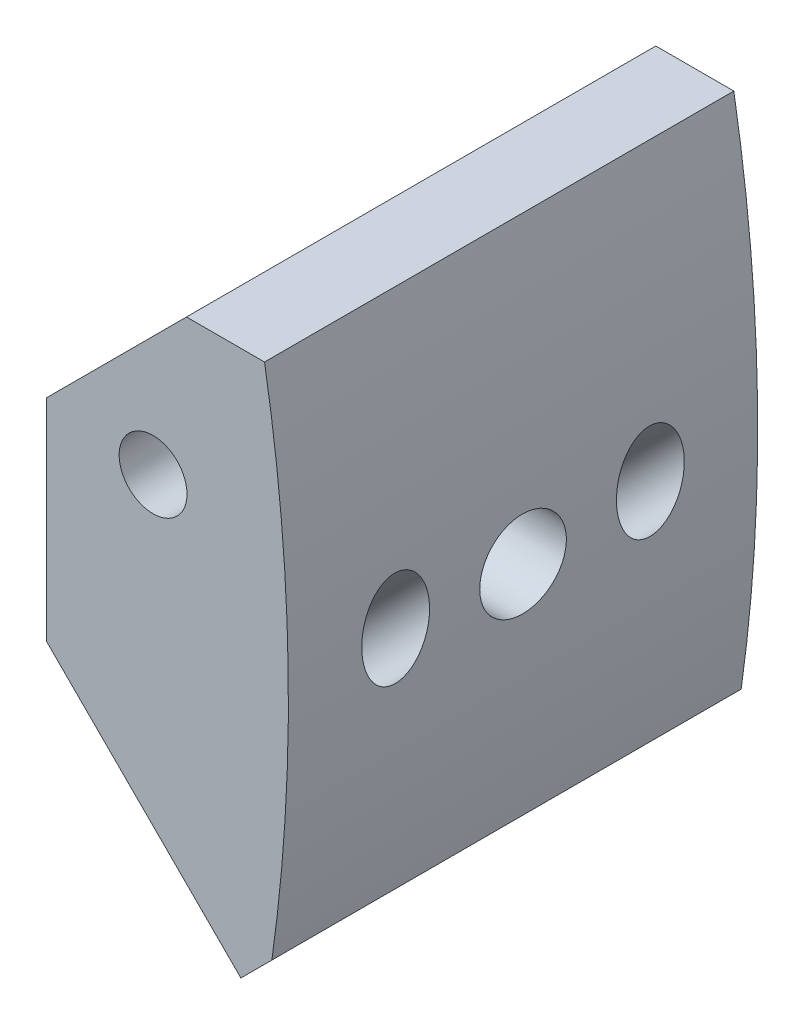
ISO-10303-21;
HEADER;
FILE_DESCRIPTION(('STEP AP214'),'2;1');
FILE_NAME('part.step','',(''),(''),'','','');
FILE_SCHEMA(('AUTOMOTIVE_DESIGN { 1 0 10303 214 1 1 1 1 }'));
ENDSEC;
DATA;
#1=APPLICATION_CONTEXT('core data for automotive mechanical design processes');
#2=APPLICATION_PROTOCOL_DEFINITION('international standard','automotive_design',2000,#1);
#3=PRODUCT_CONTEXT('',#1,'mechanical');
#4=PRODUCT('Part','Part','',(#3));
#5=PRODUCT_RELATED_PRODUCT_CATEGORY('part','',(#4));
#6=PRODUCT_DEFINITION_FORMATION('','',#4);
#7=PRODUCT_DEFINITION_CONTEXT('part definition',#1,'design');
#8=PRODUCT_DEFINITION('design','',#6,#7);
#9=PRODUCT_DEFINITION_SHAPE('','',#8);
#10=(LENGTH_UNIT() NAMED_UNIT(*) SI_UNIT(.MILLI.,.METRE.));
#11=(NAMED_UNIT(*) PLANE_ANGLE_UNIT() SI_UNIT($,.RADIAN.));
#12=(NAMED_UNIT(*) SI_UNIT($,.STERADIAN.) SOLID_ANGLE_UNIT());
#13=UNCERTAINTY_MEASURE_WITH_UNIT(LENGTH_MEASURE(1.E-05),#10,'distance_accuracy_value','');
#14=(GEOMETRIC_REPRESENTATION_CONTEXT(3) GLOBAL_UNCERTAINTY_ASSIGNED_CONTEXT((#13)) GLOBAL_UNIT_ASSIGNED_CONTEXT((#10,
#11,#12)) REPRESENTATION_CONTEXT('',''));
#15=CARTESIAN_POINT('',(0.,0.,0.));
#16=DIRECTION('',(0.,0.,1.));
#17=DIRECTION('',(1.,0.,0.));
#18=AXIS2_PLACEMENT_3D('',#15,#16,#17);
#19=CARTESIAN_POINT('',(-47.244,-6.58729003997056,18.7198));
#20=DIRECTION('',(0.,0.,-1.));
#21=DIRECTION('',(-1.,0.,0.));
#22=AXIS2_PLACEMENT_3D('',#19,#20,#21);
#23=CYLINDRICAL_SURFACE('',#22,66.294);
#24=CARTESIAN_POINT('',(19.05,-6.58729003997057,11.0871));
#25=CARTESIAN_POINT('',(19.0499996965808,-6.49029011763072,11.0870957038607));
#26=CARTESIAN_POINT('',(19.0497848234207,-6.3932202802505,11.0789012698086));
#27=CARTESIAN_POINT('',(19.0489483082885,-6.20175517058592,11.0463264377884));
#28=CARTESIAN_POINT('',(19.0483261795265,-6.10736324023725,11.0219266691839));
#29=CARTESIAN_POINT('',(19.0467456131249,-5.9240554226076,10.9576373316004));
#30=CARTESIAN_POINT('',(19.0457873390727,-5.83513689635548,10.9177552961659));
#31=CARTESIAN_POINT('',(19.0436425963866,-5.66528198959924,10.8236442233512));
#32=CARTESIAN_POINT('',(19.0424561837321,-5.58434365830945,10.7694187042804));
#33=CARTESIAN_POINT('',(19.0399882662549,-5.43269097827881,10.648135365401));
#34=CARTESIAN_POINT('',(19.0387067314511,-5.36197987388215,10.5810734891702));
#35=CARTESIAN_POINT('',(19.0361932730682,-5.2328160281673,10.4360277439134));
#36=CARTESIAN_POINT('',(19.0349613514597,-5.17436377337172,10.3580434416087));
#37=CARTESIAN_POINT('',(19.032685916437,-5.07137329412594,10.193356396944));
#38=CARTESIAN_POINT('',(19.0316424263435,-5.02683679141392,10.1066525775073));
#39=CARTESIAN_POINT('',(19.0298617644816,-4.95295334594229,9.92699542845012));
#40=CARTESIAN_POINT('',(19.0291245916354,-4.92360634973139,9.8340421208227));
#41=CARTESIAN_POINT('',(19.0280398829489,-4.8809413263353,9.64454701808837));
#42=CARTESIAN_POINT('',(19.0276922582412,-4.86761964325202,9.54800604662771));
#43=CARTESIAN_POINT('',(19.0274255738305,-4.85737214696877,9.35405747529695));
#44=CARTESIAN_POINT('',(19.0275065126475,-4.86044627714623,9.25664987842089));
#45=CARTESIAN_POINT('',(19.0280877451644,-4.88290002733904,9.06375790994818));
#46=CARTESIAN_POINT('',(19.0285879370586,-4.9022756889159,8.96827307721711));
#47=CARTESIAN_POINT('',(19.0299511275993,-4.95677637963944,8.78191186219641));
#48=CARTESIAN_POINT('',(19.0308141269425,-4.99190143902833,8.69103548875638));
#49=CARTESIAN_POINT('',(19.0328057619046,-5.07690839178007,8.51645815347474));
#50=CARTESIAN_POINT('',(19.0339344301956,-5.12679210035419,8.43275807590188));
#51=CARTESIAN_POINT('',(19.036330130382,-5.23989896873011,8.27491899974449));
#52=CARTESIAN_POINT('',(19.0375971625022,-5.30312215019547,8.20078001668767));
#53=CARTESIAN_POINT('',(19.0401272077553,-5.44113569133263,8.06414459374687));
#54=CARTESIAN_POINT('',(19.0413902195809,-5.51592948571427,8.00165162313855));
#55=CARTESIAN_POINT('',(19.0437694771187,-5.67494899416805,7.89010889306282));
#56=CARTESIAN_POINT('',(19.0448857228083,-5.75917470968648,7.84105913565682));
#57=CARTESIAN_POINT('',(19.0468456242787,-5.93466908917434,7.75779558672417));
#58=CARTESIAN_POINT('',(19.0476892780887,-6.02593780405674,7.7235819024575));
#59=CARTESIAN_POINT('',(19.0490088586277,-6.21292650873927,7.67096391731566));
#60=CARTESIAN_POINT('',(19.0494847861157,-6.30864648935182,7.65255958381096));
#61=CARTESIAN_POINT('',(19.0500151667441,-6.50179041461503,7.6320869831968));
#62=CARTESIAN_POINT('',(19.050069743725,-6.59921385015981,7.63001391611013));
#63=CARTESIAN_POINT('',(19.0497515988955,-6.79302563666371,7.64225018957412));
#64=CARTESIAN_POINT('',(19.0493788774536,-6.88941398851568,7.65655951599222));
#65=CARTESIAN_POINT('',(19.0482482255402,-7.07840609586226,7.701150411519));
#66=CARTESIAN_POINT('',(19.0474903475853,-7.17101036546318,7.73142980310495));
#67=CARTESIAN_POINT('',(19.0456747947692,-7.34982136180033,7.8070990889758));
#68=CARTESIAN_POINT('',(19.0446171194631,-7.43602807904024,7.85248900568973));
#69=CARTESIAN_POINT('',(19.0423208355982,-7.59961895748349,7.95710324508831));
#70=CARTESIAN_POINT('',(19.0410821847991,-7.67700105145836,8.0163307994683));
#71=CARTESIAN_POINT('',(19.0385636995081,-7.82072532163809,8.14693430724377));
#72=CARTESIAN_POINT('',(19.0372838649327,-7.88706747548156,8.21831028524527));
#73=CARTESIAN_POINT('',(19.0348269424432,-8.00684464408938,8.37120508147937));
#74=CARTESIAN_POINT('',(19.0336498792266,-8.06027656174518,8.45272632642443));
#75=CARTESIAN_POINT('',(19.0315315961777,-8.15269532300266,8.623585127682));
#76=CARTESIAN_POINT('',(19.0305903758834,-8.19168219490804,8.71292266867879));
#77=CARTESIAN_POINT('',(19.0290500742096,-8.25409875185362,8.89686640836887));
#78=CARTESIAN_POINT('',(19.0284509486511,-8.27753044579814,8.99147192500783));
#79=CARTESIAN_POINT('',(19.0276622613252,-8.30817809781455,9.18327581664484));
#80=CARTESIAN_POINT('',(19.0274726994678,-8.31539405945109,9.2804741910729));
#81=CARTESIAN_POINT('',(19.0275245282422,-8.31340516458679,9.47467358644387));
#82=CARTESIAN_POINT('',(19.0277657905008,-8.30420519955953,9.57167465755556));
#83=CARTESIAN_POINT('',(19.0286517995259,-8.26965564739085,9.76275500902498));
#84=CARTESIAN_POINT('',(19.0292965470955,-8.24430602810661,9.85683428356705));
#85=CARTESIAN_POINT('',(19.0309168270153,-8.17817727251902,10.0394027224271));
#86=CARTESIAN_POINT('',(19.0318923651202,-8.13739786778749,10.1278917894623));
#87=CARTESIAN_POINT('',(19.0340642058242,-8.0415692386408,10.2967653761377));
#88=CARTESIAN_POINT('',(19.0352605002712,-7.98652054112911,10.3771501948806));
#89=CARTESIAN_POINT('',(19.0377393259736,-7.86370321135577,10.5275549056016));
#90=CARTESIAN_POINT('',(19.0390218737009,-7.79593214503367,10.5975728095751));
#91=CARTESIAN_POINT('',(19.0415287850443,-7.64957731166828,10.7252560272962));
#92=CARTESIAN_POINT('',(19.0427531341612,-7.57099086895314,10.7829182752599));
#93=CARTESIAN_POINT('',(19.0450059931981,-7.4052095376815,10.8842608260837));
#94=CARTESIAN_POINT('',(19.046034383979,-7.31800946079425,10.9279326339297));
#95=CARTESIAN_POINT('',(19.0477771868896,-7.13757985767573,10.9999656701603));
#96=CARTESIAN_POINT('',(19.0484919737294,-7.04435768066933,11.0283451798781));
#97=CARTESIAN_POINT('',(19.0493357183067,-6.89000278840161,11.0614566402422));
#98=CARTESIAN_POINT('',(19.0495837449924,-6.82987223063493,11.0710608245613));
#99=CARTESIAN_POINT('',(19.0499159809689,-6.70893362867922,11.0838838509421));
#100=CARTESIAN_POINT('',(19.0500001902958,-6.64812558463983,11.0871026944142));
#101=CARTESIAN_POINT('',(19.05,-6.58729003997057,11.0871));
#102=B_SPLINE_CURVE_WITH_KNOTS('',3,(#24,#25,#26,#27,#28,#29,#30,#31,#32,#33,#34,#35,#36,#37,
#38,#39,#40,#41,#42,#43,#44,#45,#46,#47,#48,#49,#50,#51,#52,#53,#54,#55,#56,#57,#58,#59,#60,#61,
#62,#63,#64,#65,#66,#67,#68,#69,#70,#71,#72,#73,#74,#75,#76,#77,#78,#79,#80,#81,#82,#83,#84,#85,
#86,#87,#88,#89,#90,#91,#92,#93,#94,#95,#96,#97,#98,#99,#100,#101),.UNSPECIFIED.,.T.,.F.,(4,2,2,
2,2,2,2,2,2,2,2,2,2,2,2,2,2,2,2,2,2,2,2,2,2,2,2,2,2,2,2,2,2,2,2,2,2,2,4),(0.,0.290777711365592,
0.581903623562939,0.872888053476482,1.16380117397663,1.4548063782738,1.74582312964384,
2.03687587306248,2.3279275922707,2.61891290046217,2.90989720374316,3.20081086880587,
3.49172509248768,3.78267511148184,4.07362560298806,4.36466262879617,4.65569969923233,
4.94673887373656,5.23777744755217,5.52873047805297,5.81968325755811,6.11059637582465,
6.40150992590461,6.69249148509315,6.98347363365747,7.27452551839871,7.56557683284851,
7.85659055158264,8.14760420634426,8.43853116189429,8.72945869648085,9.02039129249465,
9.31131314715163,9.60229071819405,9.89334040552073,10.1845664851068,10.4754436387533,
10.6578110461634,10.84017841329),.UNSPECIFIED.);
#103=CARTESIAN_POINT('',(19.05,-6.58729003997057,11.0871));
#104=VERTEX_POINT('',#103);
#105=EDGE_CURVE('E169',#104,#104,#102,.T.);
#106=ORIENTED_EDGE('',*,*,#105,.T.);
#107=EDGE_LOOP('',(#106));
#108=FACE_BOUND('',#107,.T.);
#109=CARTESIAN_POINT('',(19.03093950099,-8.17689066280571,14.4399));
#110=CARTESIAN_POINT('',(19.0309397504888,-8.17688373606508,14.4994299092389));
#111=CARTESIAN_POINT('',(19.0310783077648,-8.17113538618392,14.5590630278307));
#112=CARTESIAN_POINT('',(19.0316118028481,-8.14864667310725,14.6762839148779));
#113=CARTESIAN_POINT('',(19.0320074198384,-8.13187718939261,14.7338658374767));
#114=CARTESIAN_POINT('',(19.0329949072261,-8.08890022916926,14.8448157281223));
#115=CARTESIAN_POINT('',(19.0335852014114,-8.06276841304478,14.8982134109924));
#116=CARTESIAN_POINT('',(19.0348944566818,-8.0027362014352,15.0003633799949));
#117=CARTESIAN_POINT('',(19.0356134275248,-7.96883521673711,15.0491153133967));
#118=CARTESIAN_POINT('',(19.0374439992075,-7.87857983434721,15.1619693773191));
#119=CARTESIAN_POINT('',(19.0385893749711,-7.8189027046317,15.2234114026122));
#120=CARTESIAN_POINT('',(19.0408509914559,-7.69052187414516,15.3360267127651));
#121=CARTESIAN_POINT('',(19.041967154257,-7.62179650096414,15.387174572624));
#122=CARTESIAN_POINT('',(19.0444749663972,-7.44905546769553,15.4983692864074));
#123=CARTESIAN_POINT('',(19.0457959560247,-7.34199252826299,15.5536745420608));
#124=CARTESIAN_POINT('',(19.0479480347883,-7.12057220248545,15.646582539313));
#125=CARTESIAN_POINT('',(19.0487787239021,-7.00620894407258,15.6841708211072));
#126=CARTESIAN_POINT('',(19.0498564383536,-6.76997817793614,15.7436243327146));
#127=CARTESIAN_POINT('',(19.0500858867901,-6.64798929327223,15.7650033410691));
#128=CARTESIAN_POINT('',(19.0498557455246,-6.40218118767083,15.7907531443561));
#129=CARTESIAN_POINT('',(19.049395635741,-6.27836065501827,15.7951110926511));
#130=CARTESIAN_POINT('',(19.047618940738,-6.00612452257654,15.7858256043066));
#131=CARTESIAN_POINT('',(19.0461473478288,-5.85782262926841,15.7683452337203));
#132=CARTESIAN_POINT('',(19.0423022857426,-5.56668691032533,15.7071205546782));
#133=CARTESIAN_POINT('',(19.0399301478624,-5.42384535400005,15.6634149604779));
#134=CARTESIAN_POINT('',(19.0355406405651,-5.19998639905921,15.5683606782304));
#135=CARTESIAN_POINT('',(19.0337064139218,-5.11532901326914,15.5255267391557));
#136=CARTESIAN_POINT('',(19.0299155060611,-4.95356747771057,15.4273827974884));
#137=CARTESIAN_POINT('',(19.027959034268,-4.87645096090689,15.3720937306922));
#138=CARTESIAN_POINT('',(19.024542635703,-4.74941051854124,15.2623773367114));
#139=CARTESIAN_POINT('',(19.0230696560592,-4.69726495319207,15.2105314965473));
#140=CARTESIAN_POINT('',(19.0202826253287,-4.60195624247808,15.0991094905497));
#141=CARTESIAN_POINT('',(19.0189683855247,-4.55878238621959,15.039542682043));
#142=CARTESIAN_POINT('',(19.0168442878389,-4.49064821714003,14.9246017053715));
#143=CARTESIAN_POINT('',(19.0159863530743,-4.46381854329087,14.8703411050301));
#144=CARTESIAN_POINT('',(19.0145527172215,-4.41954414804442,14.758094370884));
#145=CARTESIAN_POINT('',(19.013976842422,-4.40209364968191,14.7001105550368));
#146=CARTESIAN_POINT('',(19.0131684031765,-4.37771401365817,14.5816521154748));
#147=CARTESIAN_POINT('',(19.0129374776605,-4.37083509949825,14.5211669953215));
#148=CARTESIAN_POINT('',(19.0128527528125,-4.36830329984476,14.3999620861377));
#149=CARTESIAN_POINT('',(19.0129988993884,-4.37264880418048,14.3392423320138));
#150=CARTESIAN_POINT('',(19.0136241974261,-4.39144250263048,14.2242810975946));
#151=CARTESIAN_POINT('',(19.014076552431,-4.40507828136987,14.1699031685768));
#152=CARTESIAN_POINT('',(19.015241347591,-4.44073747283191,14.0639978827775));
#153=CARTESIAN_POINT('',(19.0159538266458,-4.46276214007438,14.0124709536704));
#154=CARTESIAN_POINT('',(19.0176312994868,-4.51572192999796,13.9099739407884));
#155=CARTESIAN_POINT('',(19.0186096764612,-4.54714242000995,13.8592568449645));
#156=CARTESIAN_POINT('',(19.0207157564483,-4.61673228492073,13.7627203721038));
#157=CARTESIAN_POINT('',(19.0218435475059,-4.65490564355157,13.7169039118506));
#158=CARTESIAN_POINT('',(19.0247893239268,-4.75812271316617,13.6077150544386));
#159=CARTESIAN_POINT('',(19.0266591863696,-4.82676178455779,13.5477309020521));
#160=CARTESIAN_POINT('',(19.0303784714529,-4.97280178226283,13.4395477614496));
#161=CARTESIAN_POINT('',(19.0322278326506,-5.05022380333932,13.3913780646114));
#162=CARTESIAN_POINT('',(19.0363846714238,-5.23939545277268,13.2912285417164));
#163=CARTESIAN_POINT('',(19.0386232667553,-5.35361163971813,13.2439114715794));
#164=CARTESIAN_POINT('',(19.0425725957761,-5.58802140924562,13.1682090928461));
#165=CARTESIAN_POINT('',(19.0442830280784,-5.70821835939102,13.1398345827938));
#166=CARTESIAN_POINT('',(19.0470935469368,-5.95419167506841,13.1002904478532));
#167=CARTESIAN_POINT('',(19.0481788191046,-6.08003276940403,13.089528095931));
#168=CARTESIAN_POINT('',(19.04962884144,-6.33208350038816,13.0857656228831));
#169=CARTESIAN_POINT('',(19.0499928008706,-6.45829338976348,13.0927849757213));
#170=CARTESIAN_POINT('',(19.0500082655554,-6.73136712643059,13.1274798056241));
#171=CARTESIAN_POINT('',(19.0495176363884,-6.87779706126136,13.1586910103579));
#172=CARTESIAN_POINT('',(19.0476554871312,-7.16258461609256,13.2472024912822));
#173=CARTESIAN_POINT('',(19.0462858506555,-7.30095880872602,13.3044469049614));
#174=CARTESIAN_POINT('',(19.0436559695904,-7.50760963247391,13.4177007951448));
#175=CARTESIAN_POINT('',(19.0425877251546,-7.58107921862573,13.4642957488383));
#176=CARTESIAN_POINT('',(19.0403536495612,-7.72029355684978,13.5678924769256));
#177=CARTESIAN_POINT('',(19.0391879872331,-7.78605121734095,13.6248764412789));
#178=CARTESIAN_POINT('',(19.0371545918018,-7.89312224415153,13.7357716497249));
#179=CARTESIAN_POINT('',(19.0362781184018,-7.93662249090891,13.7875615527944));
#180=CARTESIAN_POINT('',(19.0346408386178,-8.01478112524079,13.8975035982089));
#181=CARTESIAN_POINT('',(19.0338799314092,-8.04944723818555,13.9556501177115));
#182=CARTESIAN_POINT('',(19.0326901777474,-8.10233142246484,14.0665400018734));
#183=CARTESIAN_POINT('',(19.0322263601696,-8.1223770676385,14.1184095431279));
#184=CARTESIAN_POINT('',(19.031497923776,-8.15351458340183,14.2247124202177));
#185=CARTESIAN_POINT('',(19.0312327782093,-8.16463013657257,14.2791385669838));
#186=CARTESIAN_POINT('',(19.0310355972113,-8.17287968059016,14.3516161549604));
#187=CARTESIAN_POINT('',(19.0309996503764,-8.17438129465964,14.3692355013328));
#188=CARTESIAN_POINT('',(19.0309515629479,-8.17638790908686,14.4045335208673));
#189=CARTESIAN_POINT('',(19.0309394268578,-8.17689272091015,14.4222122046192));
#190=CARTESIAN_POINT('',(19.03093950099,-8.17689066280571,14.4399));
#191=B_SPLINE_CURVE_WITH_KNOTS('',3,(#109,#110,#111,#112,#113,#114,#115,#116,#117,#118,#119,
#120,#121,#122,#123,#124,#125,#126,#127,#128,#129,#130,#131,#132,#133,#134,#135,#136,#137,#138,
#139,#140,#141,#142,#143,#144,#145,#146,#147,#148,#149,#150,#151,#152,#153,#154,#155,#156,#157,
#158,#159,#160,#161,#162,#163,#164,#165,#166,#167,#168,#169,#170,#171,#172,#173,#174,#175,#176,
#177,#178,#179,#180,#181,#182,#183,#184,#185,#186,#187,#188,#189,#190),.UNSPECIFIED.,.T.,.F.,(4,
2,2,2,2,2,2,2,2,2,2,2,2,2,2,2,2,2,2,2,2,2,2,2,2,2,2,2,2,2,2,2,2,2,2,2,2,2,2,2,4),(0.,
0.178506171985479,0.357485907280734,0.535050712911975,0.712628989500063,0.968185601983157,
1.22436585657518,1.58395316400954,1.94383344457157,2.31412293514639,2.68469184760296,
3.13054371649606,3.5757390226817,3.85954039913289,4.14286824760459,4.36272671799192,
4.58232118248879,4.7631842541117,4.94393579775003,5.12554343021684,5.30712501206479,
5.47457746690626,5.64205497333309,5.82039753309282,5.99884565580937,6.27084425573026,
6.54351055082744,6.91247637575028,7.28165235701928,7.65925056727915,8.03726248996457,
8.48425685284617,8.93029654053938,9.19057455638824,9.45041049905095,9.65262032290747,
9.8546527045458,10.020812348109,10.1865298684965,10.2395583993646,10.2925969590509),.UNSPECIFIED.);
#192=CARTESIAN_POINT('',(19.03093950099,-8.17689066280571,14.4399));
#193=VERTEX_POINT('',#192);
#194=EDGE_CURVE('E130',#193,#193,#191,.T.);
#195=ORIENTED_EDGE('',*,*,#194,.T.);
#196=EDGE_LOOP('',(#195));
#197=FACE_BOUND('',#196,.T.);
#198=CARTESIAN_POINT('',(19.03093950099,-8.17689066280571,4.2799));
#199=CARTESIAN_POINT('',(19.0309397504888,-8.17688373606507,4.33942990923894));
#200=CARTESIAN_POINT('',(19.0310783077648,-8.17113538618392,4.39906302783068));
#201=CARTESIAN_POINT('',(19.0316118028481,-8.14864667310726,4.5162839148779));
#202=CARTESIAN_POINT('',(19.0320074198384,-8.13187718939262,4.57386583747667));
#203=CARTESIAN_POINT('',(19.0329949072261,-8.08890022916927,4.68481572812225));
#204=CARTESIAN_POINT('',(19.0335852014114,-8.06276841304478,4.73821341099243));
#205=CARTESIAN_POINT('',(19.0348944566818,-8.00273620143521,4.84036337999486));
#206=CARTESIAN_POINT('',(19.0356134275248,-7.96883521673713,4.88911531339669));
#207=CARTESIAN_POINT('',(19.0374439992075,-7.87857983434722,5.00196937731906));
#208=CARTESIAN_POINT('',(19.0385893749711,-7.8189027046317,5.06341140261225));
#209=CARTESIAN_POINT('',(19.0408509914559,-7.69052187414516,5.17602671276506));
#210=CARTESIAN_POINT('',(19.0419671542571,-7.62179650096414,5.227174572624));
#211=CARTESIAN_POINT('',(19.0444749663972,-7.44905546769553,5.3383692864074));
#212=CARTESIAN_POINT('',(19.0457959560247,-7.34199252826299,5.39367454206078));
#213=CARTESIAN_POINT('',(19.0479480347883,-7.12057220248546,5.48658253931305));
#214=CARTESIAN_POINT('',(19.0487787239021,-7.00620894407259,5.52417082110724));
#215=CARTESIAN_POINT('',(19.0498564383536,-6.76997817793616,5.58362433271456));
#216=CARTESIAN_POINT('',(19.0500858867901,-6.64798929327225,5.60500334106913));
#217=CARTESIAN_POINT('',(19.0498557455246,-6.40218118767085,5.63075314435609));
#218=CARTESIAN_POINT('',(19.049395635741,-6.27836065501829,5.63511109265105));
#219=CARTESIAN_POINT('',(19.047618940738,-6.00612452257656,5.62582560430656));
#220=CARTESIAN_POINT('',(19.0461473478288,-5.85782262926843,5.60834523372034));
#221=CARTESIAN_POINT('',(19.0423022857426,-5.56668691032535,5.54712055467825));
#222=CARTESIAN_POINT('',(19.0399301478624,-5.42384535400007,5.50341496047786));
#223=CARTESIAN_POINT('',(19.0355406405651,-5.19998639905923,5.4083606782304));
#224=CARTESIAN_POINT('',(19.0337064139218,-5.11532901326916,5.36552673915569));
#225=CARTESIAN_POINT('',(19.0299155060611,-4.95356747771059,5.26738279748837));
#226=CARTESIAN_POINT('',(19.027959034268,-4.87645096090691,5.21209373069217));
#227=CARTESIAN_POINT('',(19.024542635703,-4.74941051854125,5.10237733671143));
#228=CARTESIAN_POINT('',(19.0230696560592,-4.69726495319208,5.05053149654736));
#229=CARTESIAN_POINT('',(19.0202826253288,-4.60195624247809,4.93910949054972));
#230=CARTESIAN_POINT('',(19.0189683855247,-4.55878238621961,4.87954268204305));
#231=CARTESIAN_POINT('',(19.0168442878389,-4.49064821714005,4.76460170537153));
#232=CARTESIAN_POINT('',(19.0159863530743,-4.46381854329089,4.71034110503015));
#233=CARTESIAN_POINT('',(19.0145527172215,-4.41954414804444,4.59809437088406));
#234=CARTESIAN_POINT('',(19.013976842422,-4.40209364968192,4.54011055503678));
#235=CARTESIAN_POINT('',(19.0131684031765,-4.37771401365816,4.42165211547479));
#236=CARTESIAN_POINT('',(19.0129374776606,-4.37083509949824,4.3611669953215));
#237=CARTESIAN_POINT('',(19.0128527528125,-4.36830329984476,4.23996208613773));
#238=CARTESIAN_POINT('',(19.0129988993884,-4.37264880418049,4.1792423320138));
#239=CARTESIAN_POINT('',(19.0136241974261,-4.3914425026305,4.06428109759459));
#240=CARTESIAN_POINT('',(19.014076552431,-4.40507828136988,4.00990316857684));
#241=CARTESIAN_POINT('',(19.015241347591,-4.44073747283192,3.90399788277749));
#242=CARTESIAN_POINT('',(19.0159538266458,-4.46276214007439,3.85247095367045));
#243=CARTESIAN_POINT('',(19.0176312994868,-4.51572192999796,3.74997394078838));
#244=CARTESIAN_POINT('',(19.0186096764612,-4.54714242000995,3.69925684496453));
#245=CARTESIAN_POINT('',(19.0207157564483,-4.61673228492073,3.60272037210379));
#246=CARTESIAN_POINT('',(19.0218435475059,-4.65490564355157,3.55690391185064));
#247=CARTESIAN_POINT('',(19.0247893239268,-4.75812271316617,3.44771505443858));
#248=CARTESIAN_POINT('',(19.0266591863696,-4.82676178455779,3.38773090205209));
#249=CARTESIAN_POINT('',(19.0303784714529,-4.97280178226283,3.2795477614496));
#250=CARTESIAN_POINT('',(19.0322278326506,-5.05022380333931,3.23137806461139));
#251=CARTESIAN_POINT('',(19.0363846714238,-5.23939545277267,3.13122854171637));
#252=CARTESIAN_POINT('',(19.0386232667553,-5.35361163971813,3.08391147157942));
#253=CARTESIAN_POINT('',(19.0425725957761,-5.58802140924561,3.00820909284607));
#254=CARTESIAN_POINT('',(19.0442830280784,-5.70821835939102,2.97983458279381));
#255=CARTESIAN_POINT('',(19.0470935469368,-5.9541916750684,2.94029044785316));
#256=CARTESIAN_POINT('',(19.0481788191046,-6.08003276940402,2.92952809593101));
#257=CARTESIAN_POINT('',(19.04962884144,-6.33208350038815,2.92576562288308));
#258=CARTESIAN_POINT('',(19.0499928008706,-6.45829338976347,2.9327849757213));
#259=CARTESIAN_POINT('',(19.0500082655554,-6.73136712643058,2.96747980562409));
#260=CARTESIAN_POINT('',(19.0495176363884,-6.87779706126134,2.9986910103579));
#261=CARTESIAN_POINT('',(19.0476554871312,-7.16258461609254,3.08720249128223));
#262=CARTESIAN_POINT('',(19.0462858506555,-7.30095880872601,3.14444690496137));
#263=CARTESIAN_POINT('',(19.0436559695904,-7.5076096324739,3.25770079514476));
#264=CARTESIAN_POINT('',(19.0425877251546,-7.58107921862571,3.3042957488383));
#265=CARTESIAN_POINT('',(19.0403536495612,-7.72029355684977,3.40789247692561));
#266=CARTESIAN_POINT('',(19.0391879872331,-7.78605121734095,3.46487644127884));
#267=CARTESIAN_POINT('',(19.0371545918018,-7.89312224415153,3.57577164972491));
#268=CARTESIAN_POINT('',(19.0362781184018,-7.93662249090891,3.62756155279442));
#269=CARTESIAN_POINT('',(19.0346408386178,-8.01478112524079,3.73750359820891));
#270=CARTESIAN_POINT('',(19.0338799314092,-8.04944723818555,3.79565011771152));
#271=CARTESIAN_POINT('',(19.0326901777474,-8.10233142246485,3.9065400018734));
#272=CARTESIAN_POINT('',(19.0322263601695,-8.12237706763851,3.95840954312786));
#273=CARTESIAN_POINT('',(19.031497923776,-8.15351458340183,4.06471242021765));
#274=CARTESIAN_POINT('',(19.0312327782093,-8.16463013657258,4.11913856698381));
#275=CARTESIAN_POINT('',(19.0310355972113,-8.17287968059017,4.19161615496044));
#276=CARTESIAN_POINT('',(19.0309996503764,-8.17438129465965,4.20923550133281));
#277=CARTESIAN_POINT('',(19.0309515629479,-8.17638790908687,4.24453352086731));
#278=CARTESIAN_POINT('',(19.0309394268578,-8.17689272091015,4.26221220461919));
#279=CARTESIAN_POINT('',(19.03093950099,-8.17689066280571,4.2799));
#280=B_SPLINE_CURVE_WITH_KNOTS('',3,(#198,#199,#200,#201,#202,#203,#204,#205,#206,#207,#208,
#209,#210,#211,#212,#213,#214,#215,#216,#217,#218,#219,#220,#221,#222,#223,#224,#225,#226,#227,
#228,#229,#230,#231,#232,#233,#234,#235,#236,#237,#238,#239,#240,#241,#242,#243,#244,#245,#246,
#247,#248,#249,#250,#251,#252,#253,#254,#255,#256,#257,#258,#259,#260,#261,#262,#263,#264,#265,
#266,#267,#268,#269,#270,#271,#272,#273,#274,#275,#276,#277,#278,#279),.UNSPECIFIED.,.T.,.F.,(4,
2,2,2,2,2,2,2,2,2,2,2,2,2,2,2,2,2,2,2,2,2,2,2,2,2,2,2,2,2,2,2,2,2,2,2,2,2,2,2,4),(0.,
0.17850617198548,0.357485907280734,0.535050712911973,0.712628989500063,0.968185601983158,
1.22436585657519,1.58395316400954,1.94383344457157,2.31412293514638,2.68469184760295,
3.13054371649605,3.57573902268169,3.85954039913288,4.14286824760457,4.3627267179919,
4.58232118248878,4.76318425411169,4.94393579775002,5.12554343021683,5.3071250120648,
5.47457746690627,5.64205497333309,5.82039753309282,5.99884565580938,6.27084425573026,
6.54351055082744,6.91247637575027,7.28165235701927,7.65925056727914,8.03726248996456,
8.48425685284616,8.93029654053936,9.19057455638822,9.45041049905094,9.65262032290746,
9.8546527045458,10.020812348109,10.1865298684965,10.2395583993646,10.2925969590509),.UNSPECIFIED.);
#281=CARTESIAN_POINT('',(19.03093950099,-8.17689066280571,4.2799));
#282=VERTEX_POINT('',#281);
#283=EDGE_CURVE('E122',#282,#282,#280,.T.);
#284=ORIENTED_EDGE('',*,*,#283,.T.);
#285=EDGE_LOOP('',(#284));
#286=FACE_BOUND('',#285,.T.);
#287=CARTESIAN_POINT('',(-47.244,-6.58729003997056,18.7198));
#288=DIRECTION('',(0.,0.,1.));
#289=DIRECTION('',(-1.,0.,0.));
#290=AXIS2_PLACEMENT_3D('',#287,#288,#289);
#291=CIRCLE('',#290,66.294);
#292=CARTESIAN_POINT('',(18.3913235199938,-15.9092395370309,18.7198));
#293=VERTEX_POINT('',#292);
#294=CARTESIAN_POINT('',(18.0983115580606,4.60541992005886,18.7198));
#295=VERTEX_POINT('',#294);
#296=EDGE_CURVE('E114',#293,#295,#291,.T.);
#297=ORIENTED_EDGE('',*,*,#296,.F.);
#298=DIRECTION('',(0.,0.,-1.));
#299=VECTOR('',#298,1.);
#300=CARTESIAN_POINT('',(18.3913235199938,-15.9092395370309,18.7198));
#301=LINE('',#300,#299);
#302=CARTESIAN_POINT('',(18.3913235199938,-15.9092395370309,0.));
#303=VERTEX_POINT('',#302);
#304=EDGE_CURVE('E98',#293,#303,#301,.T.);
#305=ORIENTED_EDGE('',*,*,#304,.T.);
#306=CARTESIAN_POINT('',(-47.244,-6.58729003997056,0.));
#307=DIRECTION('',(0.,0.,1.));
#308=DIRECTION('',(-1.,0.,0.));
#309=AXIS2_PLACEMENT_3D('',#306,#307,#308);
#310=CIRCLE('',#309,66.294);
#311=CARTESIAN_POINT('',(18.0983115580606,4.60541992005886,0.));
#312=VERTEX_POINT('',#311);
#313=EDGE_CURVE('E107',#303,#312,#310,.T.);
#314=ORIENTED_EDGE('',*,*,#313,.T.);
#315=DIRECTION('',(0.,0.,-1.));
#316=VECTOR('',#315,1.);
#317=CARTESIAN_POINT('',(18.0983115580606,4.60541992005886,18.7198));
#318=LINE('',#317,#316);
#319=EDGE_CURVE('E178',#312,#295,#318,.F.);
#320=ORIENTED_EDGE('',*,*,#319,.T.);
#321=EDGE_LOOP('',(#297,#305,#314,#320));
#322=FACE_BOUND('',#321,.T.);
#323=ADVANCED_FACE('F41',(#108,#197,#286,#322),#23,.T.);
#324=CARTESIAN_POINT('',(-47.244,-6.58729003997056,18.7198));
#325=DIRECTION('',(0.,0.,-1.));
#326=DIRECTION('',(-1.,0.,0.));
#327=AXIS2_PLACEMENT_3D('',#324,#325,#326);
#328=PLANE('',#327);
#329=CARTESIAN_POINT('',(13.6525,-1.50729003997055,18.7198));
#330=DIRECTION('',(0.,0.,1.));
#331=DIRECTION('',(1.,0.,0.));
#332=AXIS2_PLACEMENT_3D('',#329,#330,#331);
#333=CIRCLE('',#332,1.35254999999999);
#334=CARTESIAN_POINT('',(15.00505,-1.50729003997055,18.7198));
#335=VERTEX_POINT('',#334);
#336=EDGE_CURVE('E190',#335,#335,#333,.T.);
#337=ORIENTED_EDGE('',*,*,#336,.F.);
#338=EDGE_LOOP('',(#337));
#339=FACE_BOUND('',#338,.T.);
#340=DIRECTION('',(-0.707106781186548,0.707106781186547,0.));
#341=VECTOR('',#340,1.);
#342=CARTESIAN_POINT('',(7.27621774823213,-7.26778184244048,18.7198));
#343=LINE('',#342,#341);
#344=CARTESIAN_POINT('',(17.1544994814082,-17.1460635756165,18.7198));
#345=VERTEX_POINT('',#344);
#346=CARTESIAN_POINT('',(9.398,-9.38956409420834,18.7198));
#347=VERTEX_POINT('',#346);
#348=EDGE_CURVE('E128',#345,#347,#343,.T.);
#349=ORIENTED_EDGE('',*,*,#348,.F.);
#350=DIRECTION('',(-0.707106781186547,-0.707106781186548,0.));
#351=VECTOR('',#350,1.);
#352=CARTESIAN_POINT('',(17.1544994814082,-17.1460635756165,18.7198));
#353=LINE('',#352,#351);
#354=EDGE_CURVE('E56',#293,#345,#353,.T.);
#355=ORIENTED_EDGE('',*,*,#354,.F.);
#356=ORIENTED_EDGE('',*,*,#296,.T.);
#357=DIRECTION('',(1.,0.,0.));
#358=VECTOR('',#357,1.);
#359=CARTESIAN_POINT('',(0.,4.60541992005886,18.7198));
#360=LINE('',#359,#358);
#361=CARTESIAN_POINT('',(14.986,4.60541992005886,18.7198));
#362=VERTEX_POINT('',#361);
#363=EDGE_CURVE('E182',#362,#295,#360,.T.);
#364=ORIENTED_EDGE('',*,*,#363,.F.);
#365=DIRECTION('',(0.707106781186546,0.707106781186549,0.));
#366=VECTOR('',#365,1.);
#367=CARTESIAN_POINT('',(14.986,4.60541992005886,18.7198));
#368=LINE('',#367,#366);
#369=CARTESIAN_POINT('',(9.398,-0.982580079941157,18.7198));
#370=VERTEX_POINT('',#369);
#371=EDGE_CURVE('E117',#362,#370,#368,.F.);
#372=ORIENTED_EDGE('',*,*,#371,.T.);
#373=DIRECTION('',(0.,1.,0.));
#374=VECTOR('',#373,1.);
#375=CARTESIAN_POINT('',(9.398,4.60541992005886,18.7198));
#376=LINE('',#375,#374);
#377=EDGE_CURVE('E203',#347,#370,#376,.T.);
#378=ORIENTED_EDGE('',*,*,#377,.F.);
#379=EDGE_LOOP('',(#349,#355,#356,#364,#372,#378));
#380=FACE_BOUND('',#379,.T.);
#381=ADVANCED_FACE('F156',(#339,#380),#328,.F.);
#382=CARTESIAN_POINT('',(-47.244,-6.58729003997056,0.));
#383=DIRECTION('',(0.,0.,-1.));
#384=DIRECTION('',(-1.,0.,0.));
#385=AXIS2_PLACEMENT_3D('',#382,#383,#384);
#386=PLANE('',#385);
#387=DIRECTION('',(-0.707106781186547,-0.707106781186548,0.));
#388=VECTOR('',#387,1.);
#389=CARTESIAN_POINT('',(17.1544994814082,-17.1460635756165,0.));
#390=LINE('',#389,#388);
#391=CARTESIAN_POINT('',(17.1544994814082,-17.1460635756165,0.));
#392=VERTEX_POINT('',#391);
#393=EDGE_CURVE('E93',#303,#392,#390,.T.);
#394=ORIENTED_EDGE('',*,*,#393,.T.);
#395=DIRECTION('',(0.707106781186548,-0.707106781186547,0.));
#396=VECTOR('',#395,1.);
#397=CARTESIAN_POINT('',(-20.3241370271189,20.3325729329105,0.));
#398=LINE('',#397,#396);
#399=CARTESIAN_POINT('',(9.39800000000001,-9.38956409420835,0.));
#400=VERTEX_POINT('',#399);
#401=EDGE_CURVE('E105',#400,#392,#398,.T.);
#402=ORIENTED_EDGE('',*,*,#401,.F.);
#403=DIRECTION('',(0.,1.,0.));
#404=VECTOR('',#403,1.);
#405=CARTESIAN_POINT('',(9.398,4.60541992005886,0.));
#406=LINE('',#405,#404);
#407=CARTESIAN_POINT('',(9.398,-0.982580079941164,0.));
#408=VERTEX_POINT('',#407);
#409=EDGE_CURVE('E199',#400,#408,#406,.T.);
#410=ORIENTED_EDGE('',*,*,#409,.T.);
#411=DIRECTION('',(-0.707106781186546,-0.707106781186549,0.));
#412=VECTOR('',#411,1.);
#413=CARTESIAN_POINT('',(-21.7253549800146,-32.1059350599559,0.));
#414=LINE('',#413,#412);
#415=CARTESIAN_POINT('',(14.986,4.60541992005887,0.));
#416=VERTEX_POINT('',#415);
#417=EDGE_CURVE('E11',#408,#416,#414,.F.);
#418=ORIENTED_EDGE('',*,*,#417,.T.);
#419=DIRECTION('',(1.,0.,0.));
#420=VECTOR('',#419,1.);
#421=CARTESIAN_POINT('',(0.,4.60541992005886,0.));
#422=LINE('',#421,#420);
#423=EDGE_CURVE('E185',#416,#312,#422,.T.);
#424=ORIENTED_EDGE('',*,*,#423,.T.);
#425=ORIENTED_EDGE('',*,*,#313,.F.);
#426=EDGE_LOOP('',(#394,#402,#410,#418,#424,#425));
#427=FACE_BOUND('',#426,.T.);
#428=CARTESIAN_POINT('',(13.6525,-1.50729003997055,0.));
#429=DIRECTION('',(0.,0.,1.));
#430=DIRECTION('',(1.,0.,0.));
#431=AXIS2_PLACEMENT_3D('',#428,#429,#430);
#432=CIRCLE('',#431,1.35255);
#433=CARTESIAN_POINT('',(15.00505,-1.50729003997055,0.));
#434=VERTEX_POINT('',#433);
#435=EDGE_CURVE('E186',#434,#434,#432,.T.);
#436=ORIENTED_EDGE('',*,*,#435,.T.);
#437=EDGE_LOOP('',(#436));
#438=FACE_BOUND('',#437,.T.);
#439=ADVANCED_FACE('F103',(#427,#438),#386,.T.);
#440=CARTESIAN_POINT('',(0.,4.60541992005886,0.));
#441=DIRECTION('',(0.,-1.,0.));
#442=DIRECTION('',(0.,0.,-1.));
#443=AXIS2_PLACEMENT_3D('',#440,#441,#442);
#444=PLANE('',#443);
#445=ORIENTED_EDGE('',*,*,#423,.F.);
#446=DIRECTION('',(0.,0.,1.));
#447=VECTOR('',#446,1.);
#448=CARTESIAN_POINT('',(14.986,4.60541992005886,0.));
#449=LINE('',#448,#447);
#450=EDGE_CURVE('E113',#416,#362,#449,.T.);
#451=ORIENTED_EDGE('',*,*,#450,.T.);
#452=ORIENTED_EDGE('',*,*,#363,.T.);
#453=ORIENTED_EDGE('',*,*,#319,.F.);
#454=EDGE_LOOP('',(#445,#451,#452,#453));
#455=FACE_BOUND('',#454,.T.);
#456=ADVANCED_FACE('F151',(#455),#444,.F.);
#457=CARTESIAN_POINT('',(13.6525,-1.50729003997055,18.7198));
#458=DIRECTION('',(0.,0.,1.));
#459=DIRECTION('',(1.,0.,0.));
#460=AXIS2_PLACEMENT_3D('',#457,#458,#459);
#461=CYLINDRICAL_SURFACE('',#460,1.35254999999999);
#462=ORIENTED_EDGE('',*,*,#435,.F.);
#463=EDGE_LOOP('',(#462));
#464=FACE_BOUND('',#463,.T.);
#465=ORIENTED_EDGE('',*,*,#336,.T.);
#466=EDGE_LOOP('',(#465));
#467=FACE_BOUND('',#466,.T.);
#468=ADVANCED_FACE('F147',(#464,#467),#461,.F.);
#469=CARTESIAN_POINT('',(7.27621774823213,-7.26778184244048,0.));
#470=DIRECTION('',(0.707106781186547,0.707106781186548,0.));
#471=DIRECTION('',(-0.707106781186548,0.707106781186547,0.));
#472=AXIS2_PLACEMENT_3D('',#469,#470,#471);
#473=PLANE('',#472);
#474=CARTESIAN_POINT('',(12.6517357578998,-12.6432998521082,14.4399));
#475=DIRECTION('',(-0.707106781186547,-0.707106781186548,0.));
#476=DIRECTION('',(0.707106781186548,-0.707106781186547,0.));
#477=AXIS2_PLACEMENT_3D('',#474,#475,#476);
#478=CIRCLE('',#477,1.35254999999999);
#479=CARTESIAN_POINT('',(13.6081330347937,-13.599697129002,14.4399));
#480=VERTEX_POINT('',#479);
#481=EDGE_CURVE('E211',#480,#480,#478,.T.);
#482=ORIENTED_EDGE('',*,*,#481,.F.);
#483=EDGE_LOOP('',(#482));
#484=FACE_BOUND('',#483,.T.);
#485=CARTESIAN_POINT('',(12.6517357578998,-12.6432998521082,4.2799));
#486=DIRECTION('',(-0.707106781186547,-0.707106781186548,0.));
#487=DIRECTION('',(0.707106781186548,-0.707106781186547,0.));
#488=AXIS2_PLACEMENT_3D('',#485,#486,#487);
#489=CIRCLE('',#488,1.35254999999999);
#490=CARTESIAN_POINT('',(13.6081330347937,-13.599697129002,4.2799));
#491=VERTEX_POINT('',#490);
#492=EDGE_CURVE('E129',#491,#491,#489,.T.);
#493=ORIENTED_EDGE('',*,*,#492,.F.);
#494=EDGE_LOOP('',(#493));
#495=FACE_BOUND('',#494,.T.);
#496=ORIENTED_EDGE('',*,*,#401,.T.);
#497=DIRECTION('',(0.,0.,1.));
#498=VECTOR('',#497,1.);
#499=CARTESIAN_POINT('',(17.1544994814082,-17.1460635756165,0.));
#500=LINE('',#499,#498);
#501=EDGE_CURVE('E90',#392,#345,#500,.T.);
#502=ORIENTED_EDGE('',*,*,#501,.T.);
#503=ORIENTED_EDGE('',*,*,#348,.T.);
#504=DIRECTION('',(0.,0.,-1.));
#505=VECTOR('',#504,1.);
#506=CARTESIAN_POINT('',(9.398,-9.38956409420834,0.));
#507=LINE('',#506,#505);
#508=EDGE_CURVE('E112',#347,#400,#507,.T.);
#509=ORIENTED_EDGE('',*,*,#508,.T.);
#510=EDGE_LOOP('',(#496,#502,#503,#509));
#511=FACE_BOUND('',#510,.T.);
#512=ADVANCED_FACE('F110',(#484,#495,#511),#473,.F.);
#513=CARTESIAN_POINT('',(12.6517357578998,-12.6432998521082,4.2799));
#514=DIRECTION('',(-0.707106781186547,-0.707106781186548,0.));
#515=DIRECTION('',(0.707106781186548,-0.707106781186547,0.));
#516=AXIS2_PLACEMENT_3D('',#513,#514,#515);
#517=CYLINDRICAL_SURFACE('',#516,1.35254999999999);
#518=ORIENTED_EDGE('',*,*,#492,.T.);
#519=EDGE_LOOP('',(#518));
#520=FACE_BOUND('',#519,.T.);
#521=ORIENTED_EDGE('',*,*,#283,.F.);
#522=EDGE_LOOP('',(#521));
#523=FACE_BOUND('',#522,.T.);
#524=ADVANCED_FACE('F137',(#520,#523),#517,.F.);
#525=CARTESIAN_POINT('',(12.6517357578998,-12.6432998521082,14.4399));
#526=DIRECTION('',(-0.707106781186547,-0.707106781186548,0.));
#527=DIRECTION('',(0.707106781186548,-0.707106781186547,0.));
#528=AXIS2_PLACEMENT_3D('',#525,#526,#527);
#529=CYLINDRICAL_SURFACE('',#528,1.35254999999999);
#530=ORIENTED_EDGE('',*,*,#481,.T.);
#531=EDGE_LOOP('',(#530));
#532=FACE_BOUND('',#531,.T.);
#533=ORIENTED_EDGE('',*,*,#194,.F.);
#534=EDGE_LOOP('',(#533));
#535=FACE_BOUND('',#534,.T.);
#536=ADVANCED_FACE('F141',(#532,#535),#529,.F.);
#537=CARTESIAN_POINT('',(0.,-6.58729003997057,9.3599));
#538=DIRECTION('',(-1.,0.,0.));
#539=DIRECTION('',(0.,0.,1.));
#540=AXIS2_PLACEMENT_3D('',#537,#538,#539);
#541=CYLINDRICAL_SURFACE('',#540,1.72719999999999);
#542=CARTESIAN_POINT('',(9.398,-6.58729003997057,9.3599));
#543=DIRECTION('',(1.,0.,0.));
#544=DIRECTION('',(0.,1.,0.));
#545=AXIS2_PLACEMENT_3D('',#542,#543,#544);
#546=CIRCLE('',#545,1.72719999999999);
#547=CARTESIAN_POINT('',(9.398,-4.86009003997058,9.3599));
#548=VERTEX_POINT('',#547);
#549=EDGE_CURVE('E197',#548,#548,#546,.F.);
#550=ORIENTED_EDGE('',*,*,#549,.T.);
#551=EDGE_LOOP('',(#550));
#552=FACE_BOUND('',#551,.T.);
#553=ORIENTED_EDGE('',*,*,#105,.F.);
#554=EDGE_LOOP('',(#553));
#555=FACE_BOUND('',#554,.T.);
#556=ADVANCED_FACE('F213',(#552,#555),#541,.F.);
#557=CARTESIAN_POINT('',(9.398,4.60541992005886,0.));
#558=DIRECTION('',(1.,0.,0.));
#559=DIRECTION('',(0.,1.,0.));
#560=AXIS2_PLACEMENT_3D('',#557,#558,#559);
#561=PLANE('',#560);
#562=ORIENTED_EDGE('',*,*,#549,.F.);
#563=EDGE_LOOP('',(#562));
#564=FACE_BOUND('',#563,.T.);
#565=ORIENTED_EDGE('',*,*,#377,.T.);
#566=DIRECTION('',(0.,0.,-1.));
#567=VECTOR('',#566,1.);
#568=CARTESIAN_POINT('',(9.398,-0.982580079941157,0.));
#569=LINE('',#568,#567);
#570=EDGE_CURVE('E49',#370,#408,#569,.T.);
#571=ORIENTED_EDGE('',*,*,#570,.T.);
#572=ORIENTED_EDGE('',*,*,#409,.F.);
#573=ORIENTED_EDGE('',*,*,#508,.F.);
#574=EDGE_LOOP('',(#565,#571,#572,#573));
#575=FACE_BOUND('',#574,.T.);
#576=ADVANCED_FACE('F217',(#564,#575),#561,.F.);
#577=CARTESIAN_POINT('',(14.986,4.60541992005886,0.));
#578=DIRECTION('',(0.707106781186549,-0.707106781186546,0.));
#579=DIRECTION('',(0.707106781186546,0.707106781186549,0.));
#580=AXIS2_PLACEMENT_3D('',#577,#578,#579);
#581=PLANE('',#580);
#582=ORIENTED_EDGE('',*,*,#417,.F.);
#583=ORIENTED_EDGE('',*,*,#570,.F.);
#584=ORIENTED_EDGE('',*,*,#371,.F.);
#585=ORIENTED_EDGE('',*,*,#450,.F.);
#586=EDGE_LOOP('',(#582,#583,#584,#585));
#587=FACE_BOUND('',#586,.T.);
#588=ADVANCED_FACE('F43',(#587),#581,.F.);
#589=CARTESIAN_POINT('',(17.1544994814082,-17.1460635756165,0.));
#590=DIRECTION('',(-0.707106781186548,0.707106781186547,0.));
#591=DIRECTION('',(-0.707106781186547,-0.707106781186548,0.));
#592=AXIS2_PLACEMENT_3D('',#589,#590,#591);
#593=PLANE('',#592);
#594=ORIENTED_EDGE('',*,*,#354,.T.);
#595=ORIENTED_EDGE('',*,*,#501,.F.);
#596=ORIENTED_EDGE('',*,*,#393,.F.);
#597=ORIENTED_EDGE('',*,*,#304,.F.);
#598=EDGE_LOOP('',(#594,#595,#596,#597));
#599=FACE_BOUND('',#598,.T.);
#600=ADVANCED_FACE('F92',(#599),#593,.F.);
#601=CLOSED_SHELL('',(#323,#381,#439,#456,#468,#512,#524,#536,#556,#576,#588,#600));
#602=MANIFOLD_SOLID_BREP('B2',#601);
#603=ADVANCED_BREP_SHAPE_REPRESENTATION('',(#18,#602),#14);
#604=SHAPE_DEFINITION_REPRESENTATION(#9,#603);
ENDSEC;
END-ISO-10303-21;
